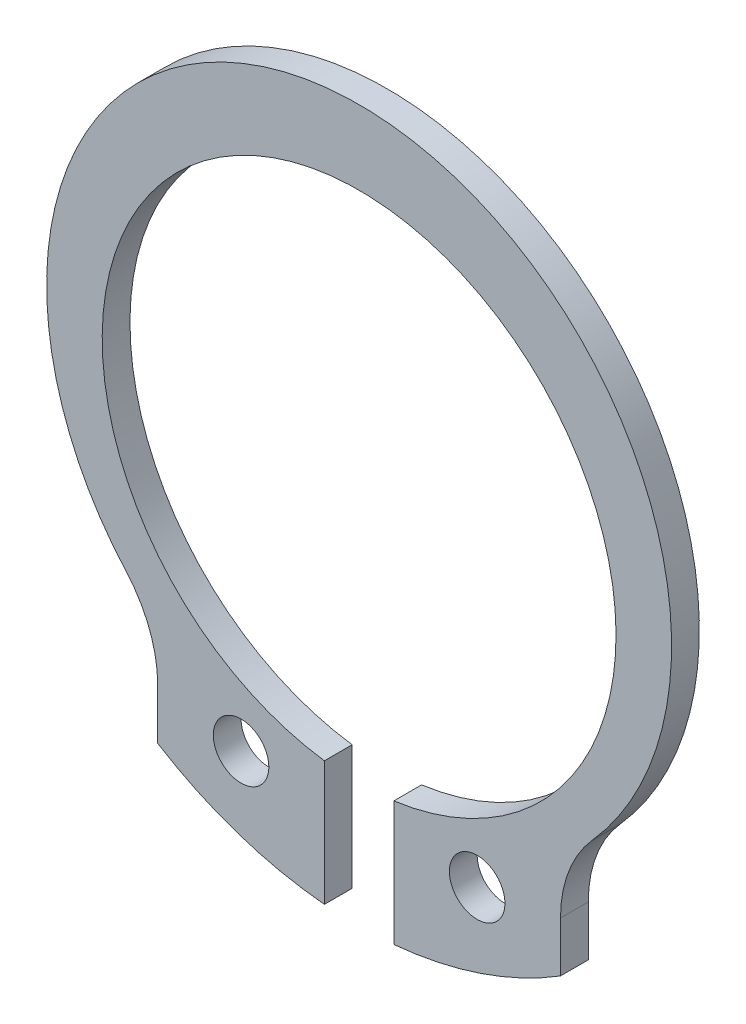
ISO-10303-21;
HEADER;
FILE_DESCRIPTION(('STEP AP214'),'2;1');
FILE_NAME('part.step','',(''),(''),'','','');
FILE_SCHEMA(('AUTOMOTIVE_DESIGN { 1 0 10303 214 1 1 1 1 }'));
ENDSEC;
DATA;
#1=APPLICATION_CONTEXT('core data for automotive mechanical design processes');
#2=APPLICATION_PROTOCOL_DEFINITION('international standard','automotive_design',2000,#1);
#3=PRODUCT_CONTEXT('',#1,'mechanical');
#4=PRODUCT('Part','Part','',(#3));
#5=PRODUCT_RELATED_PRODUCT_CATEGORY('part','',(#4));
#6=PRODUCT_DEFINITION_FORMATION('','',#4);
#7=PRODUCT_DEFINITION_CONTEXT('part definition',#1,'design');
#8=PRODUCT_DEFINITION('design','',#6,#7);
#9=PRODUCT_DEFINITION_SHAPE('','',#8);
#10=(LENGTH_UNIT() NAMED_UNIT(*) SI_UNIT(.MILLI.,.METRE.));
#11=(NAMED_UNIT(*) PLANE_ANGLE_UNIT() SI_UNIT($,.RADIAN.));
#12=(NAMED_UNIT(*) SI_UNIT($,.STERADIAN.) SOLID_ANGLE_UNIT());
#13=UNCERTAINTY_MEASURE_WITH_UNIT(LENGTH_MEASURE(1.E-05),#10,'distance_accuracy_value','');
#14=(GEOMETRIC_REPRESENTATION_CONTEXT(3) GLOBAL_UNCERTAINTY_ASSIGNED_CONTEXT((#13)) GLOBAL_UNIT_ASSIGNED_CONTEXT((#10,
#11,#12)) REPRESENTATION_CONTEXT('',''));
#15=CARTESIAN_POINT('',(0.,0.,0.));
#16=DIRECTION('',(0.,0.,1.));
#17=DIRECTION('',(1.,0.,0.));
#18=AXIS2_PLACEMENT_3D('',#15,#16,#17);
#19=CARTESIAN_POINT('',(0.,0.,-1.));
#20=DIRECTION('',(0.,0.,1.));
#21=DIRECTION('',(1.,0.,0.));
#22=AXIS2_PLACEMENT_3D('',#19,#20,#21);
#23=CYLINDRICAL_SURFACE('',#22,11.25);
#24=CARTESIAN_POINT('',(0.,0.,-1.));
#25=DIRECTION('',(0.,0.,1.));
#26=DIRECTION('',(1.,0.,0.));
#27=AXIS2_PLACEMENT_3D('',#24,#25,#26);
#28=CIRCLE('',#27,11.25);
#29=CARTESIAN_POINT('',(8.39285714285714,-7.49149177264394,-1.));
#30=VERTEX_POINT('',#29);
#31=CARTESIAN_POINT('',(-8.39285714285714,-7.49149177264394,-1.));
#32=VERTEX_POINT('',#31);
#33=EDGE_CURVE('E120',#30,#32,#28,.T.);
#34=ORIENTED_EDGE('',*,*,#33,.T.);
#35=DIRECTION('',(0.,0.,1.));
#36=VECTOR('',#35,1.);
#37=CARTESIAN_POINT('',(-8.39285714285714,-7.49149177264394,-1.));
#38=LINE('',#37,#36);
#39=CARTESIAN_POINT('',(-8.39285714285714,-7.49149177264394,0.));
#40=VERTEX_POINT('',#39);
#41=EDGE_CURVE('E182',#32,#40,#38,.T.);
#42=ORIENTED_EDGE('',*,*,#41,.T.);
#43=CARTESIAN_POINT('',(0.,0.,0.));
#44=DIRECTION('',(0.,0.,1.));
#45=DIRECTION('',(1.,0.,0.));
#46=AXIS2_PLACEMENT_3D('',#43,#44,#45);
#47=CIRCLE('',#46,11.25);
#48=CARTESIAN_POINT('',(8.39285714285714,-7.49149177264394,0.));
#49=VERTEX_POINT('',#48);
#50=EDGE_CURVE('E149',#49,#40,#47,.T.);
#51=ORIENTED_EDGE('',*,*,#50,.F.);
#52=DIRECTION('',(0.,0.,1.));
#53=VECTOR('',#52,1.);
#54=CARTESIAN_POINT('',(8.39285714285714,-7.49149177264394,-1.));
#55=LINE('',#54,#53);
#56=EDGE_CURVE('E173',#49,#30,#55,.F.);
#57=ORIENTED_EDGE('',*,*,#56,.T.);
#58=EDGE_LOOP('',(#34,#42,#51,#57));
#59=FACE_BOUND('',#58,.T.);
#60=ADVANCED_FACE('F32',(#59),#23,.T.);
#61=CARTESIAN_POINT('',(7.25,-8.60232526704263,-1.));
#62=DIRECTION('',(1.,0.,0.));
#63=DIRECTION('',(0.,0.,-1.));
#64=AXIS2_PLACEMENT_3D('',#61,#62,#63);
#65=PLANE('',#64);
#66=DIRECTION('',(0.,1.,0.));
#67=VECTOR('',#66,1.);
#68=CARTESIAN_POINT('',(7.25,-8.60232526704263,-1.));
#69=LINE('',#68,#67);
#70=CARTESIAN_POINT('',(7.25,-12.2944354701637,-1.));
#71=VERTEX_POINT('',#70);
#72=CARTESIAN_POINT('',(7.25,-10.4880884817015,-1.));
#73=VERTEX_POINT('',#72);
#74=EDGE_CURVE('E128',#71,#73,#69,.T.);
#75=ORIENTED_EDGE('',*,*,#74,.T.);
#76=DIRECTION('',(0.,0.,-1.));
#77=VECTOR('',#76,1.);
#78=CARTESIAN_POINT('',(7.25,-10.4880884817015,0.));
#79=LINE('',#78,#77);
#80=CARTESIAN_POINT('',(7.25,-10.4880884817015,0.));
#81=VERTEX_POINT('',#80);
#82=EDGE_CURVE('E186',#73,#81,#79,.F.);
#83=ORIENTED_EDGE('',*,*,#82,.T.);
#84=DIRECTION('',(0.,1.,0.));
#85=VECTOR('',#84,1.);
#86=CARTESIAN_POINT('',(7.25,-8.60232526704263,0.));
#87=LINE('',#86,#85);
#88=CARTESIAN_POINT('',(7.25,-12.2944354701637,0.));
#89=VERTEX_POINT('',#88);
#90=EDGE_CURVE('E168',#89,#81,#87,.T.);
#91=ORIENTED_EDGE('',*,*,#90,.F.);
#92=DIRECTION('',(0.,0.,1.));
#93=VECTOR('',#92,1.);
#94=CARTESIAN_POINT('',(7.25,-12.2944354701637,-1.));
#95=LINE('',#94,#93);
#96=EDGE_CURVE('E171',#71,#89,#95,.T.);
#97=ORIENTED_EDGE('',*,*,#96,.F.);
#98=EDGE_LOOP('',(#75,#83,#91,#97));
#99=FACE_BOUND('',#98,.T.);
#100=ADVANCED_FACE('F199',(#99),#65,.T.);
#101=CARTESIAN_POINT('',(0.,-0.67,-1.));
#102=DIRECTION('',(0.,0.,1.));
#103=DIRECTION('',(1.,0.,0.));
#104=AXIS2_PLACEMENT_3D('',#101,#102,#103);
#105=CYLINDRICAL_SURFACE('',#104,13.7);
#106=CARTESIAN_POINT('',(0.,-0.67,0.));
#107=DIRECTION('',(0.,0.,1.));
#108=DIRECTION('',(-1.,0.,0.));
#109=AXIS2_PLACEMENT_3D('',#106,#107,#108);
#110=CIRCLE('',#109,13.7);
#111=CARTESIAN_POINT('',(1.25,-14.3128552729991,0.));
#112=VERTEX_POINT('',#111);
#113=EDGE_CURVE('E165',#112,#89,#110,.T.);
#114=ORIENTED_EDGE('',*,*,#113,.F.);
#115=DIRECTION('',(0.,0.,1.));
#116=VECTOR('',#115,1.);
#117=CARTESIAN_POINT('',(1.25,-14.3128552729991,-1.));
#118=LINE('',#117,#116);
#119=CARTESIAN_POINT('',(1.25,-14.3128552729991,-1.));
#120=VERTEX_POINT('',#119);
#121=EDGE_CURVE('E174',#120,#112,#118,.T.);
#122=ORIENTED_EDGE('',*,*,#121,.F.);
#123=CARTESIAN_POINT('',(0.,-0.67,-1.));
#124=DIRECTION('',(0.,0.,1.));
#125=DIRECTION('',(-1.,0.,0.));
#126=AXIS2_PLACEMENT_3D('',#123,#124,#125);
#127=CIRCLE('',#126,13.7);
#128=EDGE_CURVE('E145',#120,#71,#127,.T.);
#129=ORIENTED_EDGE('',*,*,#128,.T.);
#130=ORIENTED_EDGE('',*,*,#96,.T.);
#131=EDGE_LOOP('',(#114,#122,#129,#130));
#132=FACE_BOUND('',#131,.T.);
#133=ADVANCED_FACE('F254',(#132),#105,.T.);
#134=CARTESIAN_POINT('',(1.25,-14.3128552729991,-1.));
#135=DIRECTION('',(-1.,0.,0.));
#136=DIRECTION('',(0.,-1.,0.));
#137=AXIS2_PLACEMENT_3D('',#134,#135,#136);
#138=PLANE('',#137);
#139=DIRECTION('',(0.,-1.,0.));
#140=VECTOR('',#139,1.);
#141=CARTESIAN_POINT('',(1.25,-14.3128552729991,0.));
#142=LINE('',#141,#140);
#143=CARTESIAN_POINT('',(1.25,-9.83515138991168,0.));
#144=VERTEX_POINT('',#143);
#145=EDGE_CURVE('E162',#144,#112,#142,.T.);
#146=ORIENTED_EDGE('',*,*,#145,.F.);
#147=DIRECTION('',(0.,0.,1.));
#148=VECTOR('',#147,1.);
#149=CARTESIAN_POINT('',(1.25,-9.83515138991168,-1.));
#150=LINE('',#149,#148);
#151=CARTESIAN_POINT('',(1.25,-9.83515138991168,-1.));
#152=VERTEX_POINT('',#151);
#153=EDGE_CURVE('E176',#152,#144,#150,.T.);
#154=ORIENTED_EDGE('',*,*,#153,.F.);
#155=DIRECTION('',(0.,-1.,0.));
#156=VECTOR('',#155,1.);
#157=CARTESIAN_POINT('',(1.25,-14.3128552729991,-1.));
#158=LINE('',#157,#156);
#159=EDGE_CURVE('E142',#152,#120,#158,.T.);
#160=ORIENTED_EDGE('',*,*,#159,.T.);
#161=ORIENTED_EDGE('',*,*,#121,.T.);
#162=EDGE_LOOP('',(#146,#154,#160,#161));
#163=FACE_BOUND('',#162,.T.);
#164=ADVANCED_FACE('F205',(#163),#138,.T.);
#165=CARTESIAN_POINT('',(0.,-0.67,-1.));
#166=DIRECTION('',(0.,0.,1.));
#167=DIRECTION('',(1.,0.,0.));
#168=AXIS2_PLACEMENT_3D('',#165,#166,#167);
#169=CYLINDRICAL_SURFACE('',#168,9.25);
#170=CARTESIAN_POINT('',(0.,-0.67,0.));
#171=DIRECTION('',(0.,0.,-1.));
#172=DIRECTION('',(1.,0.,0.));
#173=AXIS2_PLACEMENT_3D('',#170,#171,#172);
#174=CIRCLE('',#173,9.25);
#175=CARTESIAN_POINT('',(-1.25,-9.83515138991168,0.));
#176=VERTEX_POINT('',#175);
#177=EDGE_CURVE('E159',#176,#144,#174,.T.);
#178=ORIENTED_EDGE('',*,*,#177,.F.);
#179=DIRECTION('',(0.,0.,1.));
#180=VECTOR('',#179,1.);
#181=CARTESIAN_POINT('',(-1.25,-9.83515138991168,-1.));
#182=LINE('',#181,#180);
#183=CARTESIAN_POINT('',(-1.25,-9.83515138991168,-1.));
#184=VERTEX_POINT('',#183);
#185=EDGE_CURVE('E178',#184,#176,#182,.T.);
#186=ORIENTED_EDGE('',*,*,#185,.F.);
#187=CARTESIAN_POINT('',(0.,-0.67,-1.));
#188=DIRECTION('',(0.,0.,-1.));
#189=DIRECTION('',(1.,0.,0.));
#190=AXIS2_PLACEMENT_3D('',#187,#188,#189);
#191=CIRCLE('',#190,9.25);
#192=EDGE_CURVE('E136',#184,#152,#191,.T.);
#193=ORIENTED_EDGE('',*,*,#192,.T.);
#194=ORIENTED_EDGE('',*,*,#153,.T.);
#195=EDGE_LOOP('',(#178,#186,#193,#194));
#196=FACE_BOUND('',#195,.T.);
#197=ADVANCED_FACE('F209',(#196),#169,.F.);
#198=CARTESIAN_POINT('',(-1.25,-14.3128552729991,-1.));
#199=DIRECTION('',(1.,0.,0.));
#200=DIRECTION('',(0.,1.,0.));
#201=AXIS2_PLACEMENT_3D('',#198,#199,#200);
#202=PLANE('',#201);
#203=DIRECTION('',(0.,1.,0.));
#204=VECTOR('',#203,1.);
#205=CARTESIAN_POINT('',(-1.25,-14.3128552729991,0.));
#206=LINE('',#205,#204);
#207=CARTESIAN_POINT('',(-1.25000000000001,-14.3128552729991,0.));
#208=VERTEX_POINT('',#207);
#209=EDGE_CURVE('E156',#208,#176,#206,.T.);
#210=ORIENTED_EDGE('',*,*,#209,.F.);
#211=DIRECTION('',(0.,0.,1.));
#212=VECTOR('',#211,1.);
#213=CARTESIAN_POINT('',(-1.25000000000001,-14.3128552729991,-1.));
#214=LINE('',#213,#212);
#215=CARTESIAN_POINT('',(-1.25000000000001,-14.3128552729991,-1.));
#216=VERTEX_POINT('',#215);
#217=EDGE_CURVE('E127',#216,#208,#214,.T.);
#218=ORIENTED_EDGE('',*,*,#217,.F.);
#219=DIRECTION('',(0.,1.,0.));
#220=VECTOR('',#219,1.);
#221=CARTESIAN_POINT('',(-1.25,-14.3128552729991,-1.));
#222=LINE('',#221,#220);
#223=EDGE_CURVE('E134',#216,#184,#222,.T.);
#224=ORIENTED_EDGE('',*,*,#223,.T.);
#225=ORIENTED_EDGE('',*,*,#185,.T.);
#226=EDGE_LOOP('',(#210,#218,#224,#225));
#227=FACE_BOUND('',#226,.T.);
#228=ADVANCED_FACE('F212',(#227),#202,.T.);
#229=CARTESIAN_POINT('',(0.,-0.67,-1.));
#230=DIRECTION('',(0.,0.,1.));
#231=DIRECTION('',(1.,0.,0.));
#232=AXIS2_PLACEMENT_3D('',#229,#230,#231);
#233=CYLINDRICAL_SURFACE('',#232,13.7);
#234=CARTESIAN_POINT('',(0.,-0.67,0.));
#235=DIRECTION('',(0.,0.,1.));
#236=DIRECTION('',(1.,0.,0.));
#237=AXIS2_PLACEMENT_3D('',#234,#235,#236);
#238=CIRCLE('',#237,13.7);
#239=CARTESIAN_POINT('',(-7.25,-12.2944354701637,0.));
#240=VERTEX_POINT('',#239);
#241=EDGE_CURVE('E126',#240,#208,#238,.T.);
#242=ORIENTED_EDGE('',*,*,#241,.F.);
#243=DIRECTION('',(0.,0.,1.));
#244=VECTOR('',#243,1.);
#245=CARTESIAN_POINT('',(-7.25,-12.2944354701637,-1.));
#246=LINE('',#245,#244);
#247=CARTESIAN_POINT('',(-7.25,-12.2944354701637,-1.));
#248=VERTEX_POINT('',#247);
#249=EDGE_CURVE('E113',#248,#240,#246,.T.);
#250=ORIENTED_EDGE('',*,*,#249,.F.);
#251=CARTESIAN_POINT('',(0.,-0.67,-1.));
#252=DIRECTION('',(0.,0.,1.));
#253=DIRECTION('',(1.,0.,0.));
#254=AXIS2_PLACEMENT_3D('',#251,#252,#253);
#255=CIRCLE('',#254,13.7);
#256=EDGE_CURVE('E119',#248,#216,#255,.T.);
#257=ORIENTED_EDGE('',*,*,#256,.T.);
#258=ORIENTED_EDGE('',*,*,#217,.T.);
#259=EDGE_LOOP('',(#242,#250,#257,#258));
#260=FACE_BOUND('',#259,.T.);
#261=ADVANCED_FACE('F124',(#260),#233,.T.);
#262=CARTESIAN_POINT('',(-7.25,-8.60232526704263,-1.));
#263=DIRECTION('',(-1.,0.,0.));
#264=DIRECTION('',(0.,0.,1.));
#265=AXIS2_PLACEMENT_3D('',#262,#263,#264);
#266=PLANE('',#265);
#267=DIRECTION('',(0.,-1.,0.));
#268=VECTOR('',#267,1.);
#269=CARTESIAN_POINT('',(-7.25,-8.60232526704263,0.));
#270=LINE('',#269,#268);
#271=CARTESIAN_POINT('',(-7.25,-10.4880884817015,0.));
#272=VERTEX_POINT('',#271);
#273=EDGE_CURVE('E152',#272,#240,#270,.T.);
#274=ORIENTED_EDGE('',*,*,#273,.F.);
#275=DIRECTION('',(0.,0.,-1.));
#276=VECTOR('',#275,1.);
#277=CARTESIAN_POINT('',(-7.25,-10.4880884817015,-1.));
#278=LINE('',#277,#276);
#279=CARTESIAN_POINT('',(-7.25,-10.4880884817015,-1.));
#280=VERTEX_POINT('',#279);
#281=EDGE_CURVE('E116',#272,#280,#278,.T.);
#282=ORIENTED_EDGE('',*,*,#281,.T.);
#283=DIRECTION('',(0.,-1.,0.));
#284=VECTOR('',#283,1.);
#285=CARTESIAN_POINT('',(-7.25,-8.60232526704263,-1.));
#286=LINE('',#285,#284);
#287=EDGE_CURVE('E109',#280,#248,#286,.T.);
#288=ORIENTED_EDGE('',*,*,#287,.T.);
#289=ORIENTED_EDGE('',*,*,#249,.T.);
#290=EDGE_LOOP('',(#274,#282,#288,#289));
#291=FACE_BOUND('',#290,.T.);
#292=ADVANCED_FACE('F112',(#291),#266,.T.);
#293=CARTESIAN_POINT('',(0.,0.,-1.));
#294=DIRECTION('',(0.,0.,1.));
#295=DIRECTION('',(1.,0.,0.));
#296=AXIS2_PLACEMENT_3D('',#293,#294,#295);
#297=PLANE('',#296);
#298=CARTESIAN_POINT('',(4.25,-11.0323115181894,-1.));
#299=DIRECTION('',(0.,0.,1.));
#300=DIRECTION('',(-1.,0.,0.));
#301=AXIS2_PLACEMENT_3D('',#298,#299,#300);
#302=CIRCLE('',#301,0.999999999999998);
#303=CARTESIAN_POINT('',(3.25000000000001,-11.0323115181894,-1.));
#304=VERTEX_POINT('',#303);
#305=EDGE_CURVE('E219',#304,#304,#302,.T.);
#306=ORIENTED_EDGE('',*,*,#305,.T.);
#307=EDGE_LOOP('',(#306));
#308=FACE_BOUND('',#307,.T.);
#309=CARTESIAN_POINT('',(-4.25,-11.0323115181894,-1.));
#310=DIRECTION('',(0.,0.,1.));
#311=DIRECTION('',(1.,0.,0.));
#312=AXIS2_PLACEMENT_3D('',#309,#310,#311);
#313=CIRCLE('',#312,1.);
#314=CARTESIAN_POINT('',(-3.25,-11.0323115181894,-1.));
#315=VERTEX_POINT('',#314);
#316=EDGE_CURVE('E153',#315,#315,#313,.T.);
#317=ORIENTED_EDGE('',*,*,#316,.T.);
#318=EDGE_LOOP('',(#317));
#319=FACE_BOUND('',#318,.T.);
#320=ORIENTED_EDGE('',*,*,#33,.F.);
#321=CARTESIAN_POINT('',(11.75,-10.4880884817015,-1.));
#322=DIRECTION('',(0.,0.,1.));
#323=DIRECTION('',(1.,0.,0.));
#324=AXIS2_PLACEMENT_3D('',#321,#322,#323);
#325=CIRCLE('',#324,4.5);
#326=EDGE_CURVE('E11',#30,#73,#325,.T.);
#327=ORIENTED_EDGE('',*,*,#326,.T.);
#328=ORIENTED_EDGE('',*,*,#74,.F.);
#329=ORIENTED_EDGE('',*,*,#128,.F.);
#330=ORIENTED_EDGE('',*,*,#159,.F.);
#331=ORIENTED_EDGE('',*,*,#192,.F.);
#332=ORIENTED_EDGE('',*,*,#223,.F.);
#333=ORIENTED_EDGE('',*,*,#256,.F.);
#334=ORIENTED_EDGE('',*,*,#287,.F.);
#335=CARTESIAN_POINT('',(-11.75,-10.4880884817015,-1.));
#336=DIRECTION('',(0.,0.,1.));
#337=DIRECTION('',(1.,0.,0.));
#338=AXIS2_PLACEMENT_3D('',#335,#336,#337);
#339=CIRCLE('',#338,4.5);
#340=EDGE_CURVE('E190',#280,#32,#339,.T.);
#341=ORIENTED_EDGE('',*,*,#340,.T.);
#342=EDGE_LOOP('',(#320,#327,#328,#329,#330,#331,#332,#333,#334,#341));
#343=FACE_BOUND('',#342,.T.);
#344=ADVANCED_FACE('F131',(#308,#319,#343),#297,.F.);
#345=CARTESIAN_POINT('',(0.,0.,0.));
#346=DIRECTION('',(0.,0.,1.));
#347=DIRECTION('',(1.,0.,0.));
#348=AXIS2_PLACEMENT_3D('',#345,#346,#347);
#349=PLANE('',#348);
#350=CARTESIAN_POINT('',(4.25,-11.0323115181894,0.));
#351=DIRECTION('',(0.,0.,1.));
#352=DIRECTION('',(-1.,0.,0.));
#353=AXIS2_PLACEMENT_3D('',#350,#351,#352);
#354=CIRCLE('',#353,0.999999999999998);
#355=CARTESIAN_POINT('',(3.25000000000001,-11.0323115181894,0.));
#356=VERTEX_POINT('',#355);
#357=EDGE_CURVE('E222',#356,#356,#354,.T.);
#358=ORIENTED_EDGE('',*,*,#357,.F.);
#359=EDGE_LOOP('',(#358));
#360=FACE_BOUND('',#359,.T.);
#361=CARTESIAN_POINT('',(-4.25,-11.0323115181894,0.));
#362=DIRECTION('',(0.,0.,1.));
#363=DIRECTION('',(1.,0.,0.));
#364=AXIS2_PLACEMENT_3D('',#361,#362,#363);
#365=CIRCLE('',#364,1.);
#366=CARTESIAN_POINT('',(-3.25,-11.0323115181894,0.));
#367=VERTEX_POINT('',#366);
#368=EDGE_CURVE('E216',#367,#367,#365,.T.);
#369=ORIENTED_EDGE('',*,*,#368,.F.);
#370=EDGE_LOOP('',(#369));
#371=FACE_BOUND('',#370,.T.);
#372=ORIENTED_EDGE('',*,*,#90,.T.);
#373=CARTESIAN_POINT('',(11.75,-10.4880884817015,0.));
#374=DIRECTION('',(0.,0.,1.));
#375=DIRECTION('',(1.,0.,0.));
#376=AXIS2_PLACEMENT_3D('',#373,#374,#375);
#377=CIRCLE('',#376,4.5);
#378=EDGE_CURVE('E40',#81,#49,#377,.F.);
#379=ORIENTED_EDGE('',*,*,#378,.T.);
#380=ORIENTED_EDGE('',*,*,#50,.T.);
#381=CARTESIAN_POINT('',(-11.75,-10.4880884817015,0.));
#382=DIRECTION('',(0.,0.,1.));
#383=DIRECTION('',(1.,0.,0.));
#384=AXIS2_PLACEMENT_3D('',#381,#382,#383);
#385=CIRCLE('',#384,4.5);
#386=EDGE_CURVE('E188',#40,#272,#385,.F.);
#387=ORIENTED_EDGE('',*,*,#386,.T.);
#388=ORIENTED_EDGE('',*,*,#273,.T.);
#389=ORIENTED_EDGE('',*,*,#241,.T.);
#390=ORIENTED_EDGE('',*,*,#209,.T.);
#391=ORIENTED_EDGE('',*,*,#177,.T.);
#392=ORIENTED_EDGE('',*,*,#145,.T.);
#393=ORIENTED_EDGE('',*,*,#113,.T.);
#394=EDGE_LOOP('',(#372,#379,#380,#387,#388,#389,#390,#391,#392,#393));
#395=FACE_BOUND('',#394,.T.);
#396=ADVANCED_FACE('F193',(#360,#371,#395),#349,.T.);
#397=CARTESIAN_POINT('',(-4.25,-11.0323115181894,-1.));
#398=DIRECTION('',(0.,0.,1.));
#399=DIRECTION('',(1.,0.,0.));
#400=AXIS2_PLACEMENT_3D('',#397,#398,#399);
#401=CYLINDRICAL_SURFACE('',#400,1.);
#402=ORIENTED_EDGE('',*,*,#316,.F.);
#403=EDGE_LOOP('',(#402));
#404=FACE_BOUND('',#403,.T.);
#405=ORIENTED_EDGE('',*,*,#368,.T.);
#406=EDGE_LOOP('',(#405));
#407=FACE_BOUND('',#406,.T.);
#408=ADVANCED_FACE('F233',(#404,#407),#401,.F.);
#409=CARTESIAN_POINT('',(4.25,-11.0323115181894,-1.));
#410=DIRECTION('',(0.,0.,1.));
#411=DIRECTION('',(1.,0.,0.));
#412=AXIS2_PLACEMENT_3D('',#409,#410,#411);
#413=CYLINDRICAL_SURFACE('',#412,0.999999999999998);
#414=ORIENTED_EDGE('',*,*,#305,.F.);
#415=EDGE_LOOP('',(#414));
#416=FACE_BOUND('',#415,.T.);
#417=ORIENTED_EDGE('',*,*,#357,.T.);
#418=EDGE_LOOP('',(#417));
#419=FACE_BOUND('',#418,.T.);
#420=ADVANCED_FACE('F230',(#416,#419),#413,.F.);
#421=CARTESIAN_POINT('',(-11.75,-10.4880884817015,-1.));
#422=DIRECTION('',(0.,0.,1.));
#423=DIRECTION('',(1.,0.,0.));
#424=AXIS2_PLACEMENT_3D('',#421,#422,#423);
#425=CYLINDRICAL_SURFACE('',#424,4.5);
#426=ORIENTED_EDGE('',*,*,#340,.F.);
#427=ORIENTED_EDGE('',*,*,#281,.F.);
#428=ORIENTED_EDGE('',*,*,#386,.F.);
#429=ORIENTED_EDGE('',*,*,#41,.F.);
#430=EDGE_LOOP('',(#426,#427,#428,#429));
#431=FACE_BOUND('',#430,.T.);
#432=ADVANCED_FACE('F214',(#431),#425,.F.);
#433=CARTESIAN_POINT('',(11.75,-10.4880884817015,-1.));
#434=DIRECTION('',(0.,0.,1.));
#435=DIRECTION('',(1.,0.,0.));
#436=AXIS2_PLACEMENT_3D('',#433,#434,#435);
#437=CYLINDRICAL_SURFACE('',#436,4.5);
#438=ORIENTED_EDGE('',*,*,#326,.F.);
#439=ORIENTED_EDGE('',*,*,#56,.F.);
#440=ORIENTED_EDGE('',*,*,#378,.F.);
#441=ORIENTED_EDGE('',*,*,#82,.F.);
#442=EDGE_LOOP('',(#438,#439,#440,#441));
#443=FACE_BOUND('',#442,.T.);
#444=ADVANCED_FACE('F34',(#443),#437,.F.);
#445=CLOSED_SHELL('',(#60,#100,#133,#164,#197,#228,#261,#292,#344,#396,#408,#420,#432,#444));
#446=MANIFOLD_SOLID_BREP('B2',#445);
#447=ADVANCED_BREP_SHAPE_REPRESENTATION('',(#18,#446),#14);
#448=SHAPE_DEFINITION_REPRESENTATION(#9,#447);
ENDSEC;
END-ISO-10303-21;
